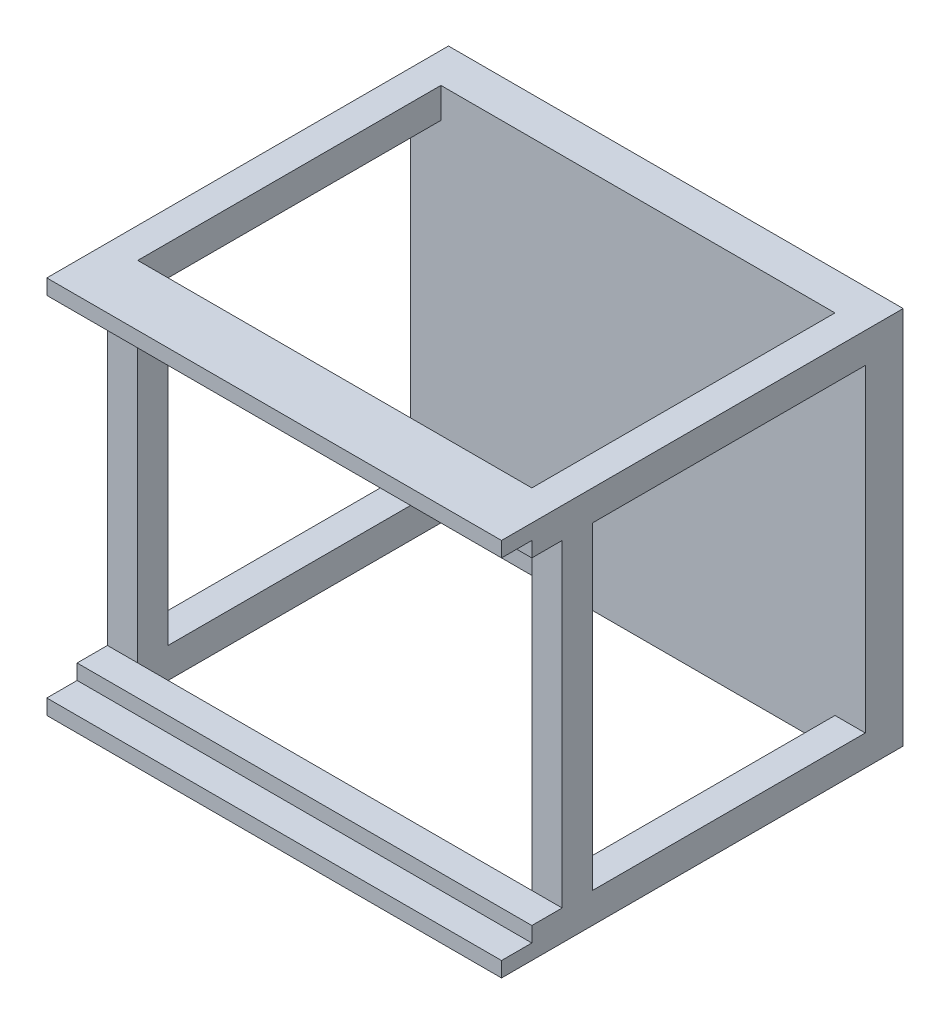
ISO-10303-21;
HEADER;
FILE_DESCRIPTION(('STEP AP214'),'2;1');
FILE_NAME('part.step','',(''),(''),'','','');
FILE_SCHEMA(('AUTOMOTIVE_DESIGN { 1 0 10303 214 1 1 1 1 }'));
ENDSEC;
DATA;
#1=APPLICATION_CONTEXT('core data for automotive mechanical design processes');
#2=APPLICATION_PROTOCOL_DEFINITION('international standard','automotive_design',2000,#1);
#3=PRODUCT_CONTEXT('',#1,'mechanical');
#4=PRODUCT('Part','Part','',(#3));
#5=PRODUCT_RELATED_PRODUCT_CATEGORY('part','',(#4));
#6=PRODUCT_DEFINITION_FORMATION('','',#4);
#7=PRODUCT_DEFINITION_CONTEXT('part definition',#1,'design');
#8=PRODUCT_DEFINITION('design','',#6,#7);
#9=PRODUCT_DEFINITION_SHAPE('','',#8);
#10=(LENGTH_UNIT() NAMED_UNIT(*) SI_UNIT(.MILLI.,.METRE.));
#11=(NAMED_UNIT(*) PLANE_ANGLE_UNIT() SI_UNIT($,.RADIAN.));
#12=(NAMED_UNIT(*) SI_UNIT($,.STERADIAN.) SOLID_ANGLE_UNIT());
#13=UNCERTAINTY_MEASURE_WITH_UNIT(LENGTH_MEASURE(1.E-05),#10,'distance_accuracy_value','');
#14=(GEOMETRIC_REPRESENTATION_CONTEXT(3) GLOBAL_UNCERTAINTY_ASSIGNED_CONTEXT((#13)) GLOBAL_UNIT_ASSIGNED_CONTEXT((#10,
#11,#12)) REPRESENTATION_CONTEXT('',''));
#15=CARTESIAN_POINT('',(0.,0.,0.));
#16=DIRECTION('',(0.,0.,1.));
#17=DIRECTION('',(1.,0.,0.));
#18=AXIS2_PLACEMENT_3D('',#15,#16,#17);
#19=CARTESIAN_POINT('',(0.,0.,245.));
#20=DIRECTION('',(0.,0.,1.));
#21=DIRECTION('',(1.,0.,0.));
#22=AXIS2_PLACEMENT_3D('',#19,#20,#21);
#23=PLANE('',#22);
#24=DIRECTION('',(0.,-1.,0.));
#25=VECTOR('',#24,1.);
#26=CARTESIAN_POINT('',(0.,20.,245.));
#27=LINE('',#26,#25);
#28=CARTESIAN_POINT('',(0.,20.,245.));
#29=VERTEX_POINT('',#28);
#30=CARTESIAN_POINT('',(0.,10.,245.));
#31=VERTEX_POINT('',#30);
#32=EDGE_CURVE('E379',#29,#31,#27,.T.);
#33=ORIENTED_EDGE('',*,*,#32,.T.);
#34=DIRECTION('',(-1.,0.,0.));
#35=VECTOR('',#34,1.);
#36=CARTESIAN_POINT('',(0.,10.,245.));
#37=LINE('',#36,#35);
#38=CARTESIAN_POINT('',(300.,10.,245.));
#39=VERTEX_POINT('',#38);
#40=EDGE_CURVE('E236',#39,#31,#37,.T.);
#41=ORIENTED_EDGE('',*,*,#40,.F.);
#42=DIRECTION('',(0.,1.,0.));
#43=VECTOR('',#42,1.);
#44=CARTESIAN_POINT('',(300.,0.,245.));
#45=LINE('',#44,#43);
#46=CARTESIAN_POINT('',(300.,20.,245.));
#47=VERTEX_POINT('',#46);
#48=EDGE_CURVE('E372',#39,#47,#45,.T.);
#49=ORIENTED_EDGE('',*,*,#48,.T.);
#50=DIRECTION('',(-1.,0.,0.));
#51=VECTOR('',#50,1.);
#52=CARTESIAN_POINT('',(20.,20.,245.));
#53=LINE('',#52,#51);
#54=EDGE_CURVE('E375',#47,#29,#53,.T.);
#55=ORIENTED_EDGE('',*,*,#54,.T.);
#56=EDGE_LOOP('',(#33,#41,#49,#55));
#57=FACE_BOUND('',#56,.T.);
#58=ADVANCED_FACE('F39',(#57),#23,.T.);
#59=CARTESIAN_POINT('',(0.,0.,245.));
#60=DIRECTION('',(0.,0.,1.));
#61=DIRECTION('',(1.,0.,0.));
#62=AXIS2_PLACEMENT_3D('',#59,#60,#61);
#63=PLANE('',#62);
#64=DIRECTION('',(0.,1.,0.));
#65=VECTOR('',#64,1.);
#66=CARTESIAN_POINT('',(300.,230.,245.));
#67=LINE('',#66,#65);
#68=CARTESIAN_POINT('',(300.,230.,245.));
#69=VERTEX_POINT('',#68);
#70=CARTESIAN_POINT('',(300.,240.,245.));
#71=VERTEX_POINT('',#70);
#72=EDGE_CURVE('E63',#69,#71,#67,.T.);
#73=ORIENTED_EDGE('',*,*,#72,.T.);
#74=DIRECTION('',(1.,0.,0.));
#75=VECTOR('',#74,1.);
#76=CARTESIAN_POINT('',(0.,240.,245.));
#77=LINE('',#76,#75);
#78=CARTESIAN_POINT('',(0.,240.,245.));
#79=VERTEX_POINT('',#78);
#80=EDGE_CURVE('E250',#79,#71,#77,.T.);
#81=ORIENTED_EDGE('',*,*,#80,.F.);
#82=DIRECTION('',(0.,-1.,0.));
#83=VECTOR('',#82,1.);
#84=CARTESIAN_POINT('',(0.,250.,245.));
#85=LINE('',#84,#83);
#86=CARTESIAN_POINT('',(0.,230.,245.));
#87=VERTEX_POINT('',#86);
#88=EDGE_CURVE('E358',#79,#87,#85,.T.);
#89=ORIENTED_EDGE('',*,*,#88,.T.);
#90=DIRECTION('',(1.,0.,0.));
#91=VECTOR('',#90,1.);
#92=CARTESIAN_POINT('',(280.,230.,245.));
#93=LINE('',#92,#91);
#94=EDGE_CURVE('E367',#87,#69,#93,.T.);
#95=ORIENTED_EDGE('',*,*,#94,.T.);
#96=EDGE_LOOP('',(#73,#81,#89,#95));
#97=FACE_BOUND('',#96,.T.);
#98=ADVANCED_FACE('F509',(#97),#63,.T.);
#99=CARTESIAN_POINT('',(0.,230.,225.));
#100=DIRECTION('',(0.,1.,0.));
#101=DIRECTION('',(0.,0.,1.));
#102=AXIS2_PLACEMENT_3D('',#99,#100,#101);
#103=PLANE('',#102);
#104=DIRECTION('',(-1.,0.,0.));
#105=VECTOR('',#104,1.);
#106=CARTESIAN_POINT('',(280.,230.,225.));
#107=LINE('',#106,#105);
#108=CARTESIAN_POINT('',(300.,230.,225.));
#109=VERTEX_POINT('',#108);
#110=CARTESIAN_POINT('',(280.,230.,225.));
#111=VERTEX_POINT('',#110);
#112=EDGE_CURVE('E279',#109,#111,#107,.T.);
#113=ORIENTED_EDGE('',*,*,#112,.F.);
#114=DIRECTION('',(0.,0.,-1.));
#115=VECTOR('',#114,1.);
#116=CARTESIAN_POINT('',(300.,230.,225.));
#117=LINE('',#116,#115);
#118=EDGE_CURVE('E391',#69,#109,#117,.T.);
#119=ORIENTED_EDGE('',*,*,#118,.F.);
#120=ORIENTED_EDGE('',*,*,#94,.F.);
#121=DIRECTION('',(0.,0.,-1.));
#122=VECTOR('',#121,1.);
#123=CARTESIAN_POINT('',(0.,230.,225.));
#124=LINE('',#123,#122);
#125=CARTESIAN_POINT('',(0.,230.,225.));
#126=VERTEX_POINT('',#125);
#127=EDGE_CURVE('E448',#87,#126,#124,.T.);
#128=ORIENTED_EDGE('',*,*,#127,.T.);
#129=DIRECTION('',(-1.,0.,0.));
#130=VECTOR('',#129,1.);
#131=CARTESIAN_POINT('',(20.,230.,225.));
#132=LINE('',#131,#130);
#133=CARTESIAN_POINT('',(20.,230.,225.));
#134=VERTEX_POINT('',#133);
#135=EDGE_CURVE('E317',#134,#126,#132,.T.);
#136=ORIENTED_EDGE('',*,*,#135,.F.);
#137=DIRECTION('',(-1.,0.,0.));
#138=VECTOR('',#137,1.);
#139=CARTESIAN_POINT('',(300.002,230.,225.));
#140=LINE('',#139,#138);
#141=EDGE_CURVE('E342',#111,#134,#140,.T.);
#142=ORIENTED_EDGE('',*,*,#141,.F.);
#143=EDGE_LOOP('',(#113,#119,#120,#128,#136,#142));
#144=FACE_BOUND('',#143,.T.);
#145=ADVANCED_FACE('F514',(#144),#103,.F.);
#146=DIRECTION('',(1.,0.,0.));
#147=VECTOR('',#146,1.);
#148=CARTESIAN_POINT('',(280.,230.,205.));
#149=LINE('',#148,#147);
#150=CARTESIAN_POINT('',(280.,230.,205.));
#151=VERTEX_POINT('',#150);
#152=CARTESIAN_POINT('',(300.,230.,205.));
#153=VERTEX_POINT('',#152);
#154=EDGE_CURVE('E276',#151,#153,#149,.T.);
#155=ORIENTED_EDGE('',*,*,#154,.F.);
#156=DIRECTION('',(0.,0.,-1.));
#157=VECTOR('',#156,1.);
#158=CARTESIAN_POINT('',(280.,230.,225.));
#159=LINE('',#158,#157);
#160=CARTESIAN_POINT('',(280.,230.,25.));
#161=VERTEX_POINT('',#160);
#162=EDGE_CURVE('E384',#151,#161,#159,.T.);
#163=ORIENTED_EDGE('',*,*,#162,.T.);
#164=DIRECTION('',(-1.,0.,0.));
#165=VECTOR('',#164,1.);
#166=CARTESIAN_POINT('',(300.,230.,25.));
#167=LINE('',#166,#165);
#168=CARTESIAN_POINT('',(300.,230.,25.));
#169=VERTEX_POINT('',#168);
#170=EDGE_CURVE('E398',#169,#161,#167,.T.);
#171=ORIENTED_EDGE('',*,*,#170,.F.);
#172=EDGE_CURVE('E383',#153,#169,#117,.T.);
#173=ORIENTED_EDGE('',*,*,#172,.F.);
#174=EDGE_LOOP('',(#155,#163,#171,#173));
#175=FACE_BOUND('',#174,.T.);
#176=ADVANCED_FACE('F585',(#175),#103,.F.);
#177=CARTESIAN_POINT('',(0.,20.,225.));
#178=DIRECTION('',(0.,1.,0.));
#179=DIRECTION('',(0.,0.,1.));
#180=AXIS2_PLACEMENT_3D('',#177,#178,#179);
#181=PLANE('',#180);
#182=DIRECTION('',(0.,0.,-1.));
#183=VECTOR('',#182,1.);
#184=CARTESIAN_POINT('',(300.,20.,225.));
#185=LINE('',#184,#183);
#186=CARTESIAN_POINT('',(300.,20.,225.));
#187=VERTEX_POINT('',#186);
#188=EDGE_CURVE('E409',#47,#187,#185,.T.);
#189=ORIENTED_EDGE('',*,*,#188,.T.);
#190=DIRECTION('',(1.,0.,0.));
#191=VECTOR('',#190,1.);
#192=CARTESIAN_POINT('',(280.,20.,225.));
#193=LINE('',#192,#191);
#194=CARTESIAN_POINT('',(280.,20.,225.));
#195=VERTEX_POINT('',#194);
#196=EDGE_CURVE('E287',#195,#187,#193,.T.);
#197=ORIENTED_EDGE('',*,*,#196,.F.);
#198=DIRECTION('',(-1.,0.,0.));
#199=VECTOR('',#198,1.);
#200=CARTESIAN_POINT('',(300.002,20.,225.));
#201=LINE('',#200,#199);
#202=CARTESIAN_POINT('',(20.,20.,225.));
#203=VERTEX_POINT('',#202);
#204=EDGE_CURVE('E359',#195,#203,#201,.T.);
#205=ORIENTED_EDGE('',*,*,#204,.T.);
#206=DIRECTION('',(1.,0.,0.));
#207=VECTOR('',#206,1.);
#208=CARTESIAN_POINT('',(20.,20.,225.));
#209=LINE('',#208,#207);
#210=CARTESIAN_POINT('',(0.,20.,225.));
#211=VERTEX_POINT('',#210);
#212=EDGE_CURVE('E304',#211,#203,#209,.T.);
#213=ORIENTED_EDGE('',*,*,#212,.F.);
#214=DIRECTION('',(0.,0.,-1.));
#215=VECTOR('',#214,1.);
#216=CARTESIAN_POINT('',(0.,20.,225.));
#217=LINE('',#216,#215);
#218=EDGE_CURVE('E428',#29,#211,#217,.T.);
#219=ORIENTED_EDGE('',*,*,#218,.F.);
#220=ORIENTED_EDGE('',*,*,#54,.F.);
#221=EDGE_LOOP('',(#189,#197,#205,#213,#219,#220));
#222=FACE_BOUND('',#221,.T.);
#223=ADVANCED_FACE('F525',(#222),#181,.T.);
#224=DIRECTION('',(0.,0.,-1.));
#225=VECTOR('',#224,1.);
#226=CARTESIAN_POINT('',(280.,20.,225.));
#227=LINE('',#226,#225);
#228=CARTESIAN_POINT('',(280.,20.,205.));
#229=VERTEX_POINT('',#228);
#230=CARTESIAN_POINT('',(280.,20.,25.));
#231=VERTEX_POINT('',#230);
#232=EDGE_CURVE('E402',#229,#231,#227,.T.);
#233=ORIENTED_EDGE('',*,*,#232,.F.);
#234=DIRECTION('',(-1.,0.,0.));
#235=VECTOR('',#234,1.);
#236=CARTESIAN_POINT('',(280.,20.,205.));
#237=LINE('',#236,#235);
#238=CARTESIAN_POINT('',(300.,20.,205.));
#239=VERTEX_POINT('',#238);
#240=EDGE_CURVE('E300',#239,#229,#237,.T.);
#241=ORIENTED_EDGE('',*,*,#240,.F.);
#242=CARTESIAN_POINT('',(300.,20.,25.));
#243=VERTEX_POINT('',#242);
#244=EDGE_CURVE('E408',#239,#243,#185,.T.);
#245=ORIENTED_EDGE('',*,*,#244,.T.);
#246=DIRECTION('',(-1.,0.,0.));
#247=VECTOR('',#246,1.);
#248=CARTESIAN_POINT('',(300.,20.,25.));
#249=LINE('',#248,#247);
#250=EDGE_CURVE('E416',#243,#231,#249,.T.);
#251=ORIENTED_EDGE('',*,*,#250,.T.);
#252=EDGE_LOOP('',(#233,#241,#245,#251));
#253=FACE_BOUND('',#252,.T.);
#254=ADVANCED_FACE('F579',(#253),#181,.T.);
#255=DIRECTION('',(1.,0.,0.));
#256=VECTOR('',#255,1.);
#257=CARTESIAN_POINT('',(20.,230.,205.));
#258=LINE('',#257,#256);
#259=CARTESIAN_POINT('',(0.,230.,205.));
#260=VERTEX_POINT('',#259);
#261=CARTESIAN_POINT('',(20.,230.,205.));
#262=VERTEX_POINT('',#261);
#263=EDGE_CURVE('E312',#260,#262,#258,.T.);
#264=ORIENTED_EDGE('',*,*,#263,.F.);
#265=CARTESIAN_POINT('',(0.,230.,25.));
#266=VERTEX_POINT('',#265);
#267=EDGE_CURVE('E447',#260,#266,#124,.T.);
#268=ORIENTED_EDGE('',*,*,#267,.T.);
#269=DIRECTION('',(1.,0.,0.));
#270=VECTOR('',#269,1.);
#271=CARTESIAN_POINT('',(0.,230.,25.));
#272=LINE('',#271,#270);
#273=CARTESIAN_POINT('',(20.,230.,25.));
#274=VERTEX_POINT('',#273);
#275=EDGE_CURVE('E439',#266,#274,#272,.T.);
#276=ORIENTED_EDGE('',*,*,#275,.T.);
#277=DIRECTION('',(0.,0.,-1.));
#278=VECTOR('',#277,1.);
#279=CARTESIAN_POINT('',(20.,230.,225.));
#280=LINE('',#279,#278);
#281=EDGE_CURVE('E454',#262,#274,#280,.T.);
#282=ORIENTED_EDGE('',*,*,#281,.F.);
#283=EDGE_LOOP('',(#264,#268,#276,#282));
#284=FACE_BOUND('',#283,.T.);
#285=ADVANCED_FACE('F577',(#284),#103,.F.);
#286=CARTESIAN_POINT('',(0.,20.,205.));
#287=VERTEX_POINT('',#286);
#288=CARTESIAN_POINT('',(0.,20.,25.));
#289=VERTEX_POINT('',#288);
#290=EDGE_CURVE('E420',#287,#289,#217,.T.);
#291=ORIENTED_EDGE('',*,*,#290,.F.);
#292=DIRECTION('',(-1.,0.,0.));
#293=VECTOR('',#292,1.);
#294=CARTESIAN_POINT('',(20.,20.,205.));
#295=LINE('',#294,#293);
#296=CARTESIAN_POINT('',(20.,20.,205.));
#297=VERTEX_POINT('',#296);
#298=EDGE_CURVE('E307',#297,#287,#295,.T.);
#299=ORIENTED_EDGE('',*,*,#298,.F.);
#300=DIRECTION('',(0.,0.,-1.));
#301=VECTOR('',#300,1.);
#302=CARTESIAN_POINT('',(20.,20.,225.));
#303=LINE('',#302,#301);
#304=CARTESIAN_POINT('',(20.,20.,25.));
#305=VERTEX_POINT('',#304);
#306=EDGE_CURVE('E421',#297,#305,#303,.T.);
#307=ORIENTED_EDGE('',*,*,#306,.T.);
#308=DIRECTION('',(1.,0.,0.));
#309=VECTOR('',#308,1.);
#310=CARTESIAN_POINT('',(0.,20.,25.));
#311=LINE('',#310,#309);
#312=EDGE_CURVE('E435',#289,#305,#311,.T.);
#313=ORIENTED_EDGE('',*,*,#312,.F.);
#314=EDGE_LOOP('',(#291,#299,#307,#313));
#315=FACE_BOUND('',#314,.T.);
#316=ADVANCED_FACE('F574',(#315),#181,.T.);
#317=CARTESIAN_POINT('',(20.,0.,225.));
#318=DIRECTION('',(-1.,0.,0.));
#319=DIRECTION('',(0.,-1.,0.));
#320=AXIS2_PLACEMENT_3D('',#317,#318,#319);
#321=PLANE('',#320);
#322=DIRECTION('',(0.,1.,0.));
#323=VECTOR('',#322,1.);
#324=CARTESIAN_POINT('',(20.,0.,225.));
#325=LINE('',#324,#323);
#326=CARTESIAN_POINT('',(20.,0.,225.));
#327=VERTEX_POINT('',#326);
#328=EDGE_CURVE('E354',#327,#203,#325,.T.);
#329=ORIENTED_EDGE('',*,*,#328,.F.);
#330=DIRECTION('',(0.,0.,-1.));
#331=VECTOR('',#330,1.);
#332=CARTESIAN_POINT('',(20.,0.,225.));
#333=LINE('',#332,#331);
#334=CARTESIAN_POINT('',(20.,0.,25.));
#335=VERTEX_POINT('',#334);
#336=EDGE_CURVE('E425',#327,#335,#333,.T.);
#337=ORIENTED_EDGE('',*,*,#336,.T.);
#338=DIRECTION('',(0.,1.,0.));
#339=VECTOR('',#338,1.);
#340=CARTESIAN_POINT('',(20.,0.,25.));
#341=LINE('',#340,#339);
#342=EDGE_CURVE('E424',#335,#305,#341,.T.);
#343=ORIENTED_EDGE('',*,*,#342,.T.);
#344=ORIENTED_EDGE('',*,*,#306,.F.);
#345=DIRECTION('',(0.,1.,0.));
#346=VECTOR('',#345,1.);
#347=CARTESIAN_POINT('',(20.,-0.002000000000002,205.));
#348=LINE('',#347,#346);
#349=EDGE_CURVE('E321',#297,#262,#348,.T.);
#350=ORIENTED_EDGE('',*,*,#349,.T.);
#351=ORIENTED_EDGE('',*,*,#281,.T.);
#352=DIRECTION('',(0.,-1.,0.));
#353=VECTOR('',#352,1.);
#354=CARTESIAN_POINT('',(20.,250.,25.));
#355=LINE('',#354,#353);
#356=CARTESIAN_POINT('',(20.,250.,25.));
#357=VERTEX_POINT('',#356);
#358=EDGE_CURVE('E443',#357,#274,#355,.T.);
#359=ORIENTED_EDGE('',*,*,#358,.F.);
#360=DIRECTION('',(0.,0.,-1.));
#361=VECTOR('',#360,1.);
#362=CARTESIAN_POINT('',(20.,250.,225.));
#363=LINE('',#362,#361);
#364=CARTESIAN_POINT('',(20.,250.,225.));
#365=VERTEX_POINT('',#364);
#366=EDGE_CURVE('E451',#365,#357,#363,.T.);
#367=ORIENTED_EDGE('',*,*,#366,.F.);
#368=DIRECTION('',(0.,1.,0.));
#369=VECTOR('',#368,1.);
#370=CARTESIAN_POINT('',(20.,230.,225.));
#371=LINE('',#370,#369);
#372=EDGE_CURVE('E336',#134,#365,#371,.T.);
#373=ORIENTED_EDGE('',*,*,#372,.F.);
#374=DIRECTION('',(0.,1.,0.));
#375=VECTOR('',#374,1.);
#376=CARTESIAN_POINT('',(20.,-0.002000000000002,225.));
#377=LINE('',#376,#375);
#378=EDGE_CURVE('E311',#203,#134,#377,.T.);
#379=ORIENTED_EDGE('',*,*,#378,.F.);
#380=EDGE_LOOP('',(#329,#337,#343,#344,#350,#351,#359,#367,#373,#379));
#381=FACE_BOUND('',#380,.T.);
#382=ADVANCED_FACE('F547',(#381),#321,.F.);
#383=CARTESIAN_POINT('',(280.,0.,225.));
#384=DIRECTION('',(-1.,0.,0.));
#385=DIRECTION('',(0.,0.,1.));
#386=AXIS2_PLACEMENT_3D('',#383,#384,#385);
#387=PLANE('',#386);
#388=DIRECTION('',(0.,0.,-1.));
#389=VECTOR('',#388,1.);
#390=CARTESIAN_POINT('',(280.,0.,225.));
#391=LINE('',#390,#389);
#392=CARTESIAN_POINT('',(280.,0.,225.));
#393=VERTEX_POINT('',#392);
#394=CARTESIAN_POINT('',(280.,0.,25.));
#395=VERTEX_POINT('',#394);
#396=EDGE_CURVE('E405',#393,#395,#391,.T.);
#397=ORIENTED_EDGE('',*,*,#396,.F.);
#398=DIRECTION('',(0.,-1.,0.));
#399=VECTOR('',#398,1.);
#400=CARTESIAN_POINT('',(280.,0.,225.));
#401=LINE('',#400,#399);
#402=EDGE_CURVE('E340',#195,#393,#401,.T.);
#403=ORIENTED_EDGE('',*,*,#402,.F.);
#404=DIRECTION('',(0.,1.,0.));
#405=VECTOR('',#404,1.);
#406=CARTESIAN_POINT('',(280.,-0.002000000000002,225.));
#407=LINE('',#406,#405);
#408=EDGE_CURVE('E283',#195,#111,#407,.T.);
#409=ORIENTED_EDGE('',*,*,#408,.T.);
#410=DIRECTION('',(0.,1.,0.));
#411=VECTOR('',#410,1.);
#412=CARTESIAN_POINT('',(280.,230.,225.));
#413=LINE('',#412,#411);
#414=CARTESIAN_POINT('',(280.,250.,225.));
#415=VERTEX_POINT('',#414);
#416=EDGE_CURVE('E316',#111,#415,#413,.T.);
#417=ORIENTED_EDGE('',*,*,#416,.T.);
#418=DIRECTION('',(0.,0.,-1.));
#419=VECTOR('',#418,1.);
#420=CARTESIAN_POINT('',(280.,250.,225.));
#421=LINE('',#420,#419);
#422=CARTESIAN_POINT('',(280.,250.,25.));
#423=VERTEX_POINT('',#422);
#424=EDGE_CURVE('E388',#415,#423,#421,.T.);
#425=ORIENTED_EDGE('',*,*,#424,.T.);
#426=DIRECTION('',(0.,-1.,0.));
#427=VECTOR('',#426,1.);
#428=CARTESIAN_POINT('',(280.,250.,25.));
#429=LINE('',#428,#427);
#430=EDGE_CURVE('E387',#423,#161,#429,.T.);
#431=ORIENTED_EDGE('',*,*,#430,.T.);
#432=ORIENTED_EDGE('',*,*,#162,.F.);
#433=DIRECTION('',(0.,1.,0.));
#434=VECTOR('',#433,1.);
#435=CARTESIAN_POINT('',(280.,-0.002000000000002,205.));
#436=LINE('',#435,#434);
#437=EDGE_CURVE('E284',#229,#151,#436,.T.);
#438=ORIENTED_EDGE('',*,*,#437,.F.);
#439=ORIENTED_EDGE('',*,*,#232,.T.);
#440=DIRECTION('',(0.,1.,0.));
#441=VECTOR('',#440,1.);
#442=CARTESIAN_POINT('',(280.,0.,25.));
#443=LINE('',#442,#441);
#444=EDGE_CURVE('E412',#395,#231,#443,.T.);
#445=ORIENTED_EDGE('',*,*,#444,.F.);
#446=EDGE_LOOP('',(#397,#403,#409,#417,#425,#431,#432,#438,#439,#445));
#447=FACE_BOUND('',#446,.T.);
#448=ADVANCED_FACE('F535',(#447),#387,.T.);
#449=CARTESIAN_POINT('',(0.,0.,25.));
#450=DIRECTION('',(0.,0.,-1.));
#451=DIRECTION('',(-1.,0.,0.));
#452=AXIS2_PLACEMENT_3D('',#449,#450,#451);
#453=PLANE('',#452);
#454=DIRECTION('',(0.,1.,0.));
#455=VECTOR('',#454,1.);
#456=CARTESIAN_POINT('',(300.,0.,25.));
#457=LINE('',#456,#455);
#458=EDGE_CURVE('E466',#243,#169,#457,.T.);
#459=ORIENTED_EDGE('',*,*,#458,.T.);
#460=ORIENTED_EDGE('',*,*,#170,.T.);
#461=ORIENTED_EDGE('',*,*,#430,.F.);
#462=DIRECTION('',(-1.,0.,0.));
#463=VECTOR('',#462,1.);
#464=CARTESIAN_POINT('',(0.,250.,25.));
#465=LINE('',#464,#463);
#466=EDGE_CURVE('E470',#423,#357,#465,.T.);
#467=ORIENTED_EDGE('',*,*,#466,.T.);
#468=ORIENTED_EDGE('',*,*,#358,.T.);
#469=ORIENTED_EDGE('',*,*,#275,.F.);
#470=DIRECTION('',(0.,-1.,0.));
#471=VECTOR('',#470,1.);
#472=CARTESIAN_POINT('',(0.,0.,25.));
#473=LINE('',#472,#471);
#474=EDGE_CURVE('E457',#266,#289,#473,.T.);
#475=ORIENTED_EDGE('',*,*,#474,.T.);
#476=ORIENTED_EDGE('',*,*,#312,.T.);
#477=ORIENTED_EDGE('',*,*,#342,.F.);
#478=DIRECTION('',(1.,0.,0.));
#479=VECTOR('',#478,1.);
#480=CARTESIAN_POINT('',(0.,0.,25.));
#481=LINE('',#480,#479);
#482=EDGE_CURVE('E461',#335,#395,#481,.T.);
#483=ORIENTED_EDGE('',*,*,#482,.T.);
#484=ORIENTED_EDGE('',*,*,#444,.T.);
#485=ORIENTED_EDGE('',*,*,#250,.F.);
#486=EDGE_LOOP('',(#459,#460,#461,#467,#468,#469,#475,#476,#477,#483,#484,#485));
#487=FACE_BOUND('',#486,.T.);
#488=ADVANCED_FACE('F542',(#487),#453,.F.);
#489=CARTESIAN_POINT('',(0.,0.,25.));
#490=DIRECTION('',(1.,0.,0.));
#491=DIRECTION('',(0.,0.,-1.));
#492=AXIS2_PLACEMENT_3D('',#489,#490,#491);
#493=PLANE('',#492);
#494=ORIENTED_EDGE('',*,*,#267,.F.);
#495=DIRECTION('',(0.,1.,0.));
#496=VECTOR('',#495,1.);
#497=CARTESIAN_POINT('',(0.,-0.002000000000002,205.));
#498=LINE('',#497,#496);
#499=EDGE_CURVE('E329',#287,#260,#498,.T.);
#500=ORIENTED_EDGE('',*,*,#499,.F.);
#501=ORIENTED_EDGE('',*,*,#290,.T.);
#502=ORIENTED_EDGE('',*,*,#474,.F.);
#503=EDGE_LOOP('',(#494,#500,#501,#502));
#504=FACE_BOUND('',#503,.T.);
#505=DIRECTION('',(0.,-1.,0.));
#506=VECTOR('',#505,1.);
#507=CARTESIAN_POINT('',(0.,0.,0.));
#508=LINE('',#507,#506);
#509=CARTESIAN_POINT('',(0.,250.,0.));
#510=VERTEX_POINT('',#509);
#511=CARTESIAN_POINT('',(0.,0.,0.));
#512=VERTEX_POINT('',#511);
#513=EDGE_CURVE('E221',#510,#512,#508,.T.);
#514=ORIENTED_EDGE('',*,*,#513,.T.);
#515=DIRECTION('',(0.,0.,-1.));
#516=VECTOR('',#515,1.);
#517=CARTESIAN_POINT('',(0.,0.,25.));
#518=LINE('',#517,#516);
#519=CARTESIAN_POINT('',(0.,0.,265.));
#520=VERTEX_POINT('',#519);
#521=EDGE_CURVE('E11',#520,#512,#518,.T.);
#522=ORIENTED_EDGE('',*,*,#521,.F.);
#523=DIRECTION('',(0.,-1.,0.));
#524=VECTOR('',#523,1.);
#525=CARTESIAN_POINT('',(0.,0.,265.));
#526=LINE('',#525,#524);
#527=CARTESIAN_POINT('',(0.,10.,265.));
#528=VERTEX_POINT('',#527);
#529=EDGE_CURVE('E218',#528,#520,#526,.T.);
#530=ORIENTED_EDGE('',*,*,#529,.F.);
#531=DIRECTION('',(0.,0.,-1.));
#532=VECTOR('',#531,1.);
#533=CARTESIAN_POINT('',(0.,10.,265.));
#534=LINE('',#533,#532);
#535=EDGE_CURVE('E244',#528,#31,#534,.T.);
#536=ORIENTED_EDGE('',*,*,#535,.T.);
#537=ORIENTED_EDGE('',*,*,#32,.F.);
#538=ORIENTED_EDGE('',*,*,#218,.T.);
#539=DIRECTION('',(0.,1.,0.));
#540=VECTOR('',#539,1.);
#541=CARTESIAN_POINT('',(0.,-0.002000000000002,225.));
#542=LINE('',#541,#540);
#543=EDGE_CURVE('E325',#211,#126,#542,.T.);
#544=ORIENTED_EDGE('',*,*,#543,.T.);
#545=ORIENTED_EDGE('',*,*,#127,.F.);
#546=ORIENTED_EDGE('',*,*,#88,.F.);
#547=DIRECTION('',(0.,0.,-1.));
#548=VECTOR('',#547,1.);
#549=CARTESIAN_POINT('',(0.,240.,265.));
#550=LINE('',#549,#548);
#551=CARTESIAN_POINT('',(0.,240.,265.));
#552=VERTEX_POINT('',#551);
#553=EDGE_CURVE('E272',#552,#79,#550,.T.);
#554=ORIENTED_EDGE('',*,*,#553,.F.);
#555=DIRECTION('',(0.,-1.,0.));
#556=VECTOR('',#555,1.);
#557=CARTESIAN_POINT('',(0.,250.,265.));
#558=LINE('',#557,#556);
#559=CARTESIAN_POINT('',(0.,250.,265.));
#560=VERTEX_POINT('',#559);
#561=EDGE_CURVE('E251',#560,#552,#558,.T.);
#562=ORIENTED_EDGE('',*,*,#561,.F.);
#563=DIRECTION('',(0.,0.,-1.));
#564=VECTOR('',#563,1.);
#565=CARTESIAN_POINT('',(0.,250.,25.));
#566=LINE('',#565,#564);
#567=EDGE_CURVE('E474',#560,#510,#566,.T.);
#568=ORIENTED_EDGE('',*,*,#567,.T.);
#569=EDGE_LOOP('',(#514,#522,#530,#536,#537,#538,#544,#545,#546,#554,#562,#568));
#570=FACE_BOUND('',#569,.T.);
#571=ADVANCED_FACE('F41',(#504,#570),#493,.F.);
#572=CARTESIAN_POINT('',(0.,0.,25.));
#573=DIRECTION('',(0.,1.,0.));
#574=DIRECTION('',(0.,0.,1.));
#575=AXIS2_PLACEMENT_3D('',#572,#573,#574);
#576=PLANE('',#575);
#577=ORIENTED_EDGE('',*,*,#336,.F.);
#578=DIRECTION('',(-1.,0.,0.));
#579=VECTOR('',#578,1.);
#580=CARTESIAN_POINT('',(300.002,0.,225.));
#581=LINE('',#580,#579);
#582=EDGE_CURVE('E353',#393,#327,#581,.T.);
#583=ORIENTED_EDGE('',*,*,#582,.F.);
#584=ORIENTED_EDGE('',*,*,#396,.T.);
#585=ORIENTED_EDGE('',*,*,#482,.F.);
#586=EDGE_LOOP('',(#577,#583,#584,#585));
#587=FACE_BOUND('',#586,.T.);
#588=DIRECTION('',(1.,0.,0.));
#589=VECTOR('',#588,1.);
#590=CARTESIAN_POINT('',(0.,0.,0.));
#591=LINE('',#590,#589);
#592=CARTESIAN_POINT('',(300.,0.,0.));
#593=VERTEX_POINT('',#592);
#594=EDGE_CURVE('E477',#512,#593,#591,.T.);
#595=ORIENTED_EDGE('',*,*,#594,.T.);
#596=DIRECTION('',(0.,0.,-1.));
#597=VECTOR('',#596,1.);
#598=CARTESIAN_POINT('',(300.,0.,25.));
#599=LINE('',#598,#597);
#600=CARTESIAN_POINT('',(300.,0.,265.));
#601=VERTEX_POINT('',#600);
#602=EDGE_CURVE('E48',#601,#593,#599,.T.);
#603=ORIENTED_EDGE('',*,*,#602,.F.);
#604=DIRECTION('',(1.,0.,0.));
#605=VECTOR('',#604,1.);
#606=CARTESIAN_POINT('',(0.,0.,265.));
#607=LINE('',#606,#605);
#608=EDGE_CURVE('E224',#520,#601,#607,.T.);
#609=ORIENTED_EDGE('',*,*,#608,.F.);
#610=ORIENTED_EDGE('',*,*,#521,.T.);
#611=EDGE_LOOP('',(#595,#603,#609,#610));
#612=FACE_BOUND('',#611,.T.);
#613=ADVANCED_FACE('F225',(#587,#612),#576,.F.);
#614=CARTESIAN_POINT('',(300.,0.,25.));
#615=DIRECTION('',(-1.,0.,0.));
#616=DIRECTION('',(0.,0.,1.));
#617=AXIS2_PLACEMENT_3D('',#614,#615,#616);
#618=PLANE('',#617);
#619=ORIENTED_EDGE('',*,*,#244,.F.);
#620=DIRECTION('',(0.,1.,0.));
#621=VECTOR('',#620,1.);
#622=CARTESIAN_POINT('',(300.,-0.002000000000002,205.));
#623=LINE('',#622,#621);
#624=EDGE_CURVE('E288',#239,#153,#623,.T.);
#625=ORIENTED_EDGE('',*,*,#624,.T.);
#626=ORIENTED_EDGE('',*,*,#172,.T.);
#627=ORIENTED_EDGE('',*,*,#458,.F.);
#628=EDGE_LOOP('',(#619,#625,#626,#627));
#629=FACE_BOUND('',#628,.T.);
#630=DIRECTION('',(0.,1.,0.));
#631=VECTOR('',#630,1.);
#632=CARTESIAN_POINT('',(300.,0.,0.));
#633=LINE('',#632,#631);
#634=CARTESIAN_POINT('',(300.,250.,0.));
#635=VERTEX_POINT('',#634);
#636=EDGE_CURVE('E480',#593,#635,#633,.T.);
#637=ORIENTED_EDGE('',*,*,#636,.T.);
#638=DIRECTION('',(0.,0.,-1.));
#639=VECTOR('',#638,1.);
#640=CARTESIAN_POINT('',(300.,250.,25.));
#641=LINE('',#640,#639);
#642=CARTESIAN_POINT('',(300.,250.,265.));
#643=VERTEX_POINT('',#642);
#644=EDGE_CURVE('E487',#643,#635,#641,.T.);
#645=ORIENTED_EDGE('',*,*,#644,.F.);
#646=DIRECTION('',(0.,1.,0.));
#647=VECTOR('',#646,1.);
#648=CARTESIAN_POINT('',(300.,250.,265.));
#649=LINE('',#648,#647);
#650=CARTESIAN_POINT('',(300.,240.,265.));
#651=VERTEX_POINT('',#650);
#652=EDGE_CURVE('E258',#651,#643,#649,.T.);
#653=ORIENTED_EDGE('',*,*,#652,.F.);
#654=DIRECTION('',(0.,0.,-1.));
#655=VECTOR('',#654,1.);
#656=CARTESIAN_POINT('',(300.,240.,265.));
#657=LINE('',#656,#655);
#658=EDGE_CURVE('E266',#651,#71,#657,.T.);
#659=ORIENTED_EDGE('',*,*,#658,.T.);
#660=ORIENTED_EDGE('',*,*,#72,.F.);
#661=ORIENTED_EDGE('',*,*,#118,.T.);
#662=DIRECTION('',(0.,1.,0.));
#663=VECTOR('',#662,1.);
#664=CARTESIAN_POINT('',(300.,-0.002000000000002,225.));
#665=LINE('',#664,#663);
#666=EDGE_CURVE('E292',#187,#109,#665,.T.);
#667=ORIENTED_EDGE('',*,*,#666,.F.);
#668=ORIENTED_EDGE('',*,*,#188,.F.);
#669=ORIENTED_EDGE('',*,*,#48,.F.);
#670=DIRECTION('',(0.,0.,-1.));
#671=VECTOR('',#670,1.);
#672=CARTESIAN_POINT('',(300.,10.,265.));
#673=LINE('',#672,#671);
#674=CARTESIAN_POINT('',(300.,10.,265.));
#675=VERTEX_POINT('',#674);
#676=EDGE_CURVE('E55',#675,#39,#673,.T.);
#677=ORIENTED_EDGE('',*,*,#676,.F.);
#678=DIRECTION('',(0.,1.,0.));
#679=VECTOR('',#678,1.);
#680=CARTESIAN_POINT('',(300.,0.,265.));
#681=LINE('',#680,#679);
#682=EDGE_CURVE('E230',#601,#675,#681,.T.);
#683=ORIENTED_EDGE('',*,*,#682,.F.);
#684=ORIENTED_EDGE('',*,*,#602,.T.);
#685=EDGE_LOOP('',(#637,#645,#653,#659,#660,#661,#667,#668,#669,#677,#683,#684));
#686=FACE_BOUND('',#685,.T.);
#687=ADVANCED_FACE('F493',(#629,#686),#618,.F.);
#688=CARTESIAN_POINT('',(0.,250.,25.));
#689=DIRECTION('',(0.,-1.,0.));
#690=DIRECTION('',(0.,0.,-1.));
#691=AXIS2_PLACEMENT_3D('',#688,#689,#690);
#692=PLANE('',#691);
#693=DIRECTION('',(-1.,0.,0.));
#694=VECTOR('',#693,1.);
#695=CARTESIAN_POINT('',(300.002,250.,225.));
#696=LINE('',#695,#694);
#697=EDGE_CURVE('E341',#415,#365,#696,.T.);
#698=ORIENTED_EDGE('',*,*,#697,.T.);
#699=ORIENTED_EDGE('',*,*,#366,.T.);
#700=ORIENTED_EDGE('',*,*,#466,.F.);
#701=ORIENTED_EDGE('',*,*,#424,.F.);
#702=EDGE_LOOP('',(#698,#699,#700,#701));
#703=FACE_BOUND('',#702,.T.);
#704=DIRECTION('',(-1.,0.,0.));
#705=VECTOR('',#704,1.);
#706=CARTESIAN_POINT('',(0.,250.,0.));
#707=LINE('',#706,#705);
#708=EDGE_CURVE('E462',#635,#510,#707,.T.);
#709=ORIENTED_EDGE('',*,*,#708,.T.);
#710=ORIENTED_EDGE('',*,*,#567,.F.);
#711=DIRECTION('',(-1.,0.,0.));
#712=VECTOR('',#711,1.);
#713=CARTESIAN_POINT('',(0.,250.,265.));
#714=LINE('',#713,#712);
#715=EDGE_CURVE('E262',#643,#560,#714,.T.);
#716=ORIENTED_EDGE('',*,*,#715,.F.);
#717=ORIENTED_EDGE('',*,*,#644,.T.);
#718=EDGE_LOOP('',(#709,#710,#716,#717));
#719=FACE_BOUND('',#718,.T.);
#720=ADVANCED_FACE('F498',(#703,#719),#692,.F.);
#721=CARTESIAN_POINT('',(0.,0.,0.));
#722=DIRECTION('',(0.,0.,-1.));
#723=DIRECTION('',(-1.,0.,0.));
#724=AXIS2_PLACEMENT_3D('',#721,#722,#723);
#725=PLANE('',#724);
#726=ORIENTED_EDGE('',*,*,#513,.F.);
#727=ORIENTED_EDGE('',*,*,#708,.F.);
#728=ORIENTED_EDGE('',*,*,#636,.F.);
#729=ORIENTED_EDGE('',*,*,#594,.F.);
#730=EDGE_LOOP('',(#726,#727,#728,#729));
#731=FACE_BOUND('',#730,.T.);
#732=ADVANCED_FACE('F496',(#731),#725,.T.);
#733=CARTESIAN_POINT('',(300.002,0.,225.));
#734=DIRECTION('',(0.,0.,1.));
#735=DIRECTION('',(1.,0.,0.));
#736=AXIS2_PLACEMENT_3D('',#733,#734,#735);
#737=PLANE('',#736);
#738=ORIENTED_EDGE('',*,*,#204,.F.);
#739=ORIENTED_EDGE('',*,*,#402,.T.);
#740=ORIENTED_EDGE('',*,*,#582,.T.);
#741=ORIENTED_EDGE('',*,*,#328,.T.);
#742=EDGE_LOOP('',(#738,#739,#740,#741));
#743=FACE_BOUND('',#742,.T.);
#744=ADVANCED_FACE('F530',(#743),#737,.F.);
#745=CARTESIAN_POINT('',(300.002,230.,225.));
#746=DIRECTION('',(0.,0.,1.));
#747=DIRECTION('',(1.,0.,0.));
#748=AXIS2_PLACEMENT_3D('',#745,#746,#747);
#749=PLANE('',#748);
#750=ORIENTED_EDGE('',*,*,#416,.F.);
#751=ORIENTED_EDGE('',*,*,#141,.T.);
#752=ORIENTED_EDGE('',*,*,#372,.T.);
#753=ORIENTED_EDGE('',*,*,#697,.F.);
#754=EDGE_LOOP('',(#750,#751,#752,#753));
#755=FACE_BOUND('',#754,.T.);
#756=ADVANCED_FACE('F626',(#755),#749,.F.);
#757=CARTESIAN_POINT('',(20.,-0.002000000000002,205.));
#758=DIRECTION('',(0.,0.,1.));
#759=DIRECTION('',(1.,0.,0.));
#760=AXIS2_PLACEMENT_3D('',#757,#758,#759);
#761=PLANE('',#760);
#762=ORIENTED_EDGE('',*,*,#349,.F.);
#763=ORIENTED_EDGE('',*,*,#298,.T.);
#764=ORIENTED_EDGE('',*,*,#499,.T.);
#765=ORIENTED_EDGE('',*,*,#263,.T.);
#766=EDGE_LOOP('',(#762,#763,#764,#765));
#767=FACE_BOUND('',#766,.T.);
#768=ADVANCED_FACE('F607',(#767),#761,.F.);
#769=CARTESIAN_POINT('',(20.,-0.002000000000002,225.));
#770=DIRECTION('',(0.,0.,-1.));
#771=DIRECTION('',(-1.,0.,0.));
#772=AXIS2_PLACEMENT_3D('',#769,#770,#771);
#773=PLANE('',#772);
#774=ORIENTED_EDGE('',*,*,#543,.F.);
#775=ORIENTED_EDGE('',*,*,#212,.T.);
#776=ORIENTED_EDGE('',*,*,#378,.T.);
#777=ORIENTED_EDGE('',*,*,#135,.T.);
#778=EDGE_LOOP('',(#774,#775,#776,#777));
#779=FACE_BOUND('',#778,.T.);
#780=ADVANCED_FACE('F552',(#779),#773,.F.);
#781=CARTESIAN_POINT('',(280.,-0.002000000000002,225.));
#782=DIRECTION('',(0.,0.,-1.));
#783=DIRECTION('',(-1.,0.,0.));
#784=AXIS2_PLACEMENT_3D('',#781,#782,#783);
#785=PLANE('',#784);
#786=ORIENTED_EDGE('',*,*,#408,.F.);
#787=ORIENTED_EDGE('',*,*,#196,.T.);
#788=ORIENTED_EDGE('',*,*,#666,.T.);
#789=ORIENTED_EDGE('',*,*,#112,.T.);
#790=EDGE_LOOP('',(#786,#787,#788,#789));
#791=FACE_BOUND('',#790,.T.);
#792=ADVANCED_FACE('F521',(#791),#785,.F.);
#793=CARTESIAN_POINT('',(280.,-0.002000000000002,205.));
#794=DIRECTION('',(0.,0.,1.));
#795=DIRECTION('',(1.,0.,0.));
#796=AXIS2_PLACEMENT_3D('',#793,#794,#795);
#797=PLANE('',#796);
#798=ORIENTED_EDGE('',*,*,#624,.F.);
#799=ORIENTED_EDGE('',*,*,#240,.T.);
#800=ORIENTED_EDGE('',*,*,#437,.T.);
#801=ORIENTED_EDGE('',*,*,#154,.T.);
#802=EDGE_LOOP('',(#798,#799,#800,#801));
#803=FACE_BOUND('',#802,.T.);
#804=ADVANCED_FACE('F634',(#803),#797,.F.);
#805=CARTESIAN_POINT('',(0.,240.,265.));
#806=DIRECTION('',(0.,1.,0.));
#807=DIRECTION('',(0.,0.,1.));
#808=AXIS2_PLACEMENT_3D('',#805,#806,#807);
#809=PLANE('',#808);
#810=ORIENTED_EDGE('',*,*,#80,.T.);
#811=ORIENTED_EDGE('',*,*,#658,.F.);
#812=DIRECTION('',(1.,0.,0.));
#813=VECTOR('',#812,1.);
#814=CARTESIAN_POINT('',(0.,240.,265.));
#815=LINE('',#814,#813);
#816=EDGE_CURVE('E255',#552,#651,#815,.T.);
#817=ORIENTED_EDGE('',*,*,#816,.F.);
#818=ORIENTED_EDGE('',*,*,#553,.T.);
#819=EDGE_LOOP('',(#810,#811,#817,#818));
#820=FACE_BOUND('',#819,.T.);
#821=ADVANCED_FACE('F508',(#820),#809,.F.);
#822=CARTESIAN_POINT('',(0.,0.,265.));
#823=DIRECTION('',(0.,0.,1.));
#824=DIRECTION('',(1.,0.,0.));
#825=AXIS2_PLACEMENT_3D('',#822,#823,#824);
#826=PLANE('',#825);
#827=ORIENTED_EDGE('',*,*,#561,.T.);
#828=ORIENTED_EDGE('',*,*,#816,.T.);
#829=ORIENTED_EDGE('',*,*,#652,.T.);
#830=ORIENTED_EDGE('',*,*,#715,.T.);
#831=EDGE_LOOP('',(#827,#828,#829,#830));
#832=FACE_BOUND('',#831,.T.);
#833=ADVANCED_FACE('F504',(#832),#826,.T.);
#834=CARTESIAN_POINT('',(0.,10.,265.));
#835=DIRECTION('',(0.,-1.,0.));
#836=DIRECTION('',(0.,0.,-1.));
#837=AXIS2_PLACEMENT_3D('',#834,#835,#836);
#838=PLANE('',#837);
#839=ORIENTED_EDGE('',*,*,#40,.T.);
#840=ORIENTED_EDGE('',*,*,#535,.F.);
#841=DIRECTION('',(-1.,0.,0.));
#842=VECTOR('',#841,1.);
#843=CARTESIAN_POINT('',(0.,10.,265.));
#844=LINE('',#843,#842);
#845=EDGE_CURVE('E233',#675,#528,#844,.T.);
#846=ORIENTED_EDGE('',*,*,#845,.F.);
#847=ORIENTED_EDGE('',*,*,#676,.T.);
#848=EDGE_LOOP('',(#839,#840,#846,#847));
#849=FACE_BOUND('',#848,.T.);
#850=ADVANCED_FACE('F555',(#849),#838,.F.);
#851=CARTESIAN_POINT('',(0.,0.,265.));
#852=DIRECTION('',(0.,0.,-1.));
#853=DIRECTION('',(-1.,0.,0.));
#854=AXIS2_PLACEMENT_3D('',#851,#852,#853);
#855=PLANE('',#854);
#856=ORIENTED_EDGE('',*,*,#529,.T.);
#857=ORIENTED_EDGE('',*,*,#608,.T.);
#858=ORIENTED_EDGE('',*,*,#682,.T.);
#859=ORIENTED_EDGE('',*,*,#845,.T.);
#860=EDGE_LOOP('',(#856,#857,#858,#859));
#861=FACE_BOUND('',#860,.T.);
#862=ADVANCED_FACE('F232',(#861),#855,.F.);
#863=CLOSED_SHELL('',(#58,#98,#145,#176,#223,#254,#285,#316,#382,#448,#488,#571,#613,#687,#720,
#732,#744,#756,#768,#780,#792,#804,#821,#833,#850,#862));
#864=MANIFOLD_SOLID_BREP('B2',#863);
#865=ADVANCED_BREP_SHAPE_REPRESENTATION('',(#18,#864),#14);
#866=SHAPE_DEFINITION_REPRESENTATION(#9,#865);
ENDSEC;
END-ISO-10303-21;
